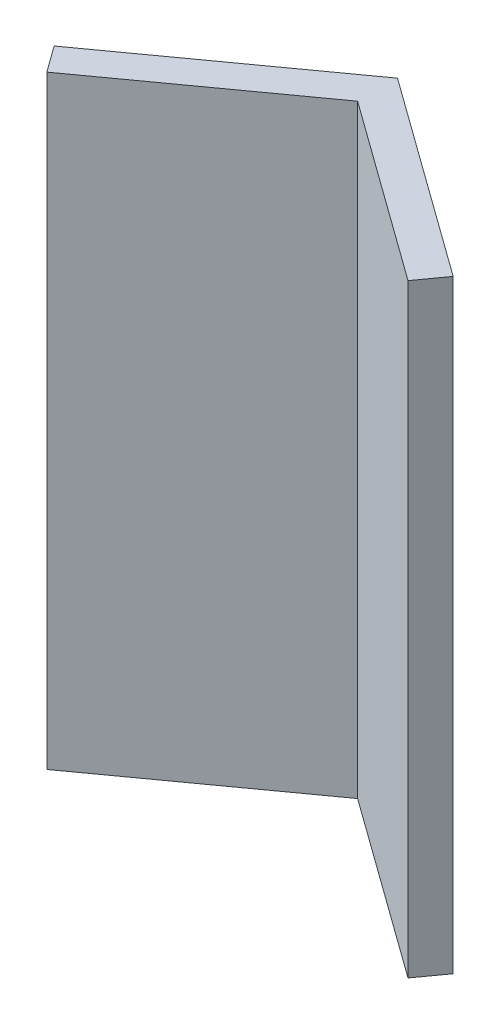
ISO-10303-21;
HEADER;
FILE_DESCRIPTION(('STEP AP214'),'2;1');
FILE_NAME('part.step','',(''),(''),'','','');
FILE_SCHEMA(('AUTOMOTIVE_DESIGN { 1 0 10303 214 1 1 1 1 }'));
ENDSEC;
DATA;
#1=APPLICATION_CONTEXT('core data for automotive mechanical design processes');
#2=APPLICATION_PROTOCOL_DEFINITION('international standard','automotive_design',2000,#1);
#3=PRODUCT_CONTEXT('',#1,'mechanical');
#4=PRODUCT('Part','Part','',(#3));
#5=PRODUCT_RELATED_PRODUCT_CATEGORY('part','',(#4));
#6=PRODUCT_DEFINITION_FORMATION('','',#4);
#7=PRODUCT_DEFINITION_CONTEXT('part definition',#1,'design');
#8=PRODUCT_DEFINITION('design','',#6,#7);
#9=PRODUCT_DEFINITION_SHAPE('','',#8);
#10=(LENGTH_UNIT() NAMED_UNIT(*) SI_UNIT(.MILLI.,.METRE.));
#11=(NAMED_UNIT(*) PLANE_ANGLE_UNIT() SI_UNIT($,.RADIAN.));
#12=(NAMED_UNIT(*) SI_UNIT($,.STERADIAN.) SOLID_ANGLE_UNIT());
#13=UNCERTAINTY_MEASURE_WITH_UNIT(LENGTH_MEASURE(1.E-05),#10,'distance_accuracy_value','');
#14=(GEOMETRIC_REPRESENTATION_CONTEXT(3) GLOBAL_UNCERTAINTY_ASSIGNED_CONTEXT((#13)) GLOBAL_UNIT_ASSIGNED_CONTEXT((#10,
#11,#12)) REPRESENTATION_CONTEXT('',''));
#15=CARTESIAN_POINT('',(0.,0.,0.));
#16=DIRECTION('',(0.,0.,1.));
#17=DIRECTION('',(1.,0.,0.));
#18=AXIS2_PLACEMENT_3D('',#15,#16,#17);
#19=CARTESIAN_POINT('',(33.3006662701754,18.9537375855651,160.949579943678));
#20=DIRECTION('',(0.584774228030169,0.,-0.811196093575234));
#21=DIRECTION('',(-0.811196093575234,0.,-0.584774228030169));
#22=AXIS2_PLACEMENT_3D('',#19,#20,#21);
#23=PLANE('',#22);
#24=DIRECTION('',(0.,1.,0.));
#25=VECTOR('',#24,1.);
#26=CARTESIAN_POINT('',(14.8006662701754,18.9537375855651,147.613318459876));
#27=LINE('',#26,#25);
#28=CARTESIAN_POINT('',(14.8006662701754,18.9537375855651,147.613318459876));
#29=VERTEX_POINT('',#28);
#30=CARTESIAN_POINT('',(14.8006662701754,74.9537375855651,147.613318459876));
#31=VERTEX_POINT('',#30);
#32=EDGE_CURVE('E37',#29,#31,#27,.T.);
#33=ORIENTED_EDGE('',*,*,#32,.T.);
#34=DIRECTION('',(-0.811196093575234,0.,-0.584774228030169));
#35=VECTOR('',#34,1.);
#36=CARTESIAN_POINT('',(33.3006662701754,74.9537375855651,160.949579943678));
#37=LINE('',#36,#35);
#38=CARTESIAN_POINT('',(33.3006662701754,74.9537375855651,160.949579943678));
#39=VERTEX_POINT('',#38);
#40=EDGE_CURVE('E86',#39,#31,#37,.T.);
#41=ORIENTED_EDGE('',*,*,#40,.F.);
#42=DIRECTION('',(0.,1.,0.));
#43=VECTOR('',#42,1.);
#44=CARTESIAN_POINT('',(33.3006662701754,18.9537375855651,160.949579943678));
#45=LINE('',#44,#43);
#46=CARTESIAN_POINT('',(33.3006662701754,18.9537375855651,160.949579943678));
#47=VERTEX_POINT('',#46);
#48=EDGE_CURVE('E11',#47,#39,#45,.T.);
#49=ORIENTED_EDGE('',*,*,#48,.F.);
#50=DIRECTION('',(-0.811196093575234,0.,-0.584774228030169));
#51=VECTOR('',#50,1.);
#52=CARTESIAN_POINT('',(33.3006662701754,18.9537375855651,160.949579943678));
#53=LINE('',#52,#51);
#54=EDGE_CURVE('E87',#47,#29,#53,.T.);
#55=ORIENTED_EDGE('',*,*,#54,.T.);
#56=EDGE_LOOP('',(#33,#41,#49,#55));
#57=FACE_BOUND('',#56,.T.);
#58=ADVANCED_FACE('F34',(#57),#23,.T.);
#59=CARTESIAN_POINT('',(31.5463435860849,18.9537375855651,163.383168224404));
#60=DIRECTION('',(0.811196093575223,0.,0.584774228030184));
#61=DIRECTION('',(0.584774228030184,0.,-0.811196093575223));
#62=AXIS2_PLACEMENT_3D('',#59,#60,#61);
#63=PLANE('',#62);
#64=ORIENTED_EDGE('',*,*,#48,.T.);
#65=DIRECTION('',(0.584774228030184,0.,-0.811196093575223));
#66=VECTOR('',#65,1.);
#67=CARTESIAN_POINT('',(31.5463435860849,74.9537375855651,163.383168224404));
#68=LINE('',#67,#66);
#69=CARTESIAN_POINT('',(31.5463435860849,74.9537375855651,163.383168224404));
#70=VERTEX_POINT('',#69);
#71=EDGE_CURVE('E104',#70,#39,#68,.T.);
#72=ORIENTED_EDGE('',*,*,#71,.F.);
#73=DIRECTION('',(0.,1.,0.));
#74=VECTOR('',#73,1.);
#75=CARTESIAN_POINT('',(31.5463435860849,18.9537375855651,163.383168224404));
#76=LINE('',#75,#74);
#77=CARTESIAN_POINT('',(31.5463435860849,18.9537375855651,163.383168224404));
#78=VERTEX_POINT('',#77);
#79=EDGE_CURVE('E42',#78,#70,#76,.T.);
#80=ORIENTED_EDGE('',*,*,#79,.F.);
#81=DIRECTION('',(0.584774228030184,0.,-0.811196093575223));
#82=VECTOR('',#81,1.);
#83=CARTESIAN_POINT('',(31.5463435860849,18.9537375855651,163.383168224404));
#84=LINE('',#83,#82);
#85=EDGE_CURVE('E92',#78,#47,#84,.T.);
#86=ORIENTED_EDGE('',*,*,#85,.T.);
#87=EDGE_LOOP('',(#64,#72,#80,#86));
#88=FACE_BOUND('',#87,.T.);
#89=ADVANCED_FACE('F144',(#88),#63,.T.);
#90=CARTESIAN_POINT('',(14.8006662701754,18.9537375855651,151.31156112125));
#91=DIRECTION('',(-0.584774228030171,0.,0.811196093575233));
#92=DIRECTION('',(0.811196093575233,0.,0.584774228030171));
#93=AXIS2_PLACEMENT_3D('',#90,#91,#92);
#94=PLANE('',#93);
#95=ORIENTED_EDGE('',*,*,#79,.T.);
#96=DIRECTION('',(0.811196093575233,0.,0.584774228030171));
#97=VECTOR('',#96,1.);
#98=CARTESIAN_POINT('',(14.8006662701754,74.9537375855651,151.31156112125));
#99=LINE('',#98,#97);
#100=CARTESIAN_POINT('',(14.8006662701754,74.9537375855651,151.31156112125));
#101=VERTEX_POINT('',#100);
#102=EDGE_CURVE('E111',#101,#70,#99,.T.);
#103=ORIENTED_EDGE('',*,*,#102,.F.);
#104=DIRECTION('',(0.,1.,0.));
#105=VECTOR('',#104,1.);
#106=CARTESIAN_POINT('',(14.8006662701754,18.9537375855651,151.31156112125));
#107=LINE('',#106,#105);
#108=CARTESIAN_POINT('',(14.8006662701754,18.9537375855651,151.31156112125));
#109=VERTEX_POINT('',#108);
#110=EDGE_CURVE('E127',#109,#101,#107,.T.);
#111=ORIENTED_EDGE('',*,*,#110,.F.);
#112=DIRECTION('',(0.811196093575233,0.,0.584774228030171));
#113=VECTOR('',#112,1.);
#114=CARTESIAN_POINT('',(14.8006662701754,18.9537375855651,151.31156112125));
#115=LINE('',#114,#113);
#116=EDGE_CURVE('E123',#109,#78,#115,.T.);
#117=ORIENTED_EDGE('',*,*,#116,.T.);
#118=EDGE_LOOP('',(#95,#103,#111,#117));
#119=FACE_BOUND('',#118,.T.);
#120=ADVANCED_FACE('F140',(#119),#94,.T.);
#121=CARTESIAN_POINT('',(-1.94501104573404,18.9537375855651,163.383168224404));
#122=DIRECTION('',(0.58477422803017,0.,0.811196093575233));
#123=DIRECTION('',(0.811196093575233,0.,-0.58477422803017));
#124=AXIS2_PLACEMENT_3D('',#121,#122,#123);
#125=PLANE('',#124);
#126=ORIENTED_EDGE('',*,*,#110,.T.);
#127=DIRECTION('',(0.811196093575233,0.,-0.58477422803017));
#128=VECTOR('',#127,1.);
#129=CARTESIAN_POINT('',(-1.94501104573404,74.9537375855651,163.383168224404));
#130=LINE('',#129,#128);
#131=CARTESIAN_POINT('',(-1.94501104573404,74.9537375855651,163.383168224404));
#132=VERTEX_POINT('',#131);
#133=EDGE_CURVE('E108',#132,#101,#130,.T.);
#134=ORIENTED_EDGE('',*,*,#133,.F.);
#135=DIRECTION('',(0.,1.,0.));
#136=VECTOR('',#135,1.);
#137=CARTESIAN_POINT('',(-1.94501104573404,18.9537375855651,163.383168224404));
#138=LINE('',#137,#136);
#139=CARTESIAN_POINT('',(-1.94501104573404,18.9537375855651,163.383168224404));
#140=VERTEX_POINT('',#139);
#141=EDGE_CURVE('E129',#140,#132,#138,.T.);
#142=ORIENTED_EDGE('',*,*,#141,.F.);
#143=DIRECTION('',(0.811196093575233,0.,-0.58477422803017));
#144=VECTOR('',#143,1.);
#145=CARTESIAN_POINT('',(-1.94501104573404,18.9537375855651,163.383168224404));
#146=LINE('',#145,#144);
#147=EDGE_CURVE('E120',#140,#109,#146,.T.);
#148=ORIENTED_EDGE('',*,*,#147,.T.);
#149=EDGE_LOOP('',(#126,#134,#142,#148));
#150=FACE_BOUND('',#149,.T.);
#151=ADVANCED_FACE('F137',(#150),#125,.T.);
#152=CARTESIAN_POINT('',(-3.69933372982456,18.9537375855651,160.949579943678));
#153=DIRECTION('',(-0.811196093575232,0.,0.584774228030172));
#154=DIRECTION('',(0.584774228030172,0.,0.811196093575232));
#155=AXIS2_PLACEMENT_3D('',#152,#153,#154);
#156=PLANE('',#155);
#157=ORIENTED_EDGE('',*,*,#141,.T.);
#158=DIRECTION('',(0.584774228030172,0.,0.811196093575232));
#159=VECTOR('',#158,1.);
#160=CARTESIAN_POINT('',(-3.69933372982456,74.9537375855651,160.949579943678));
#161=LINE('',#160,#159);
#162=CARTESIAN_POINT('',(-3.69933372982456,74.9537375855651,160.949579943678));
#163=VERTEX_POINT('',#162);
#164=EDGE_CURVE('E99',#163,#132,#161,.T.);
#165=ORIENTED_EDGE('',*,*,#164,.F.);
#166=DIRECTION('',(0.,1.,0.));
#167=VECTOR('',#166,1.);
#168=CARTESIAN_POINT('',(-3.69933372982456,18.9537375855651,160.949579943678));
#169=LINE('',#168,#167);
#170=CARTESIAN_POINT('',(-3.69933372982456,18.9537375855651,160.949579943678));
#171=VERTEX_POINT('',#170);
#172=EDGE_CURVE('E91',#171,#163,#169,.T.);
#173=ORIENTED_EDGE('',*,*,#172,.F.);
#174=DIRECTION('',(0.584774228030172,0.,0.811196093575232));
#175=VECTOR('',#174,1.);
#176=CARTESIAN_POINT('',(-3.69933372982456,18.9537375855651,160.949579943678));
#177=LINE('',#176,#175);
#178=EDGE_CURVE('E117',#171,#140,#177,.T.);
#179=ORIENTED_EDGE('',*,*,#178,.T.);
#180=EDGE_LOOP('',(#157,#165,#173,#179));
#181=FACE_BOUND('',#180,.T.);
#182=ADVANCED_FACE('F131',(#181),#156,.T.);
#183=CARTESIAN_POINT('',(14.8006662701754,18.9537375855651,147.613318459876));
#184=DIRECTION('',(-0.58477422803017,0.,-0.811196093575234));
#185=DIRECTION('',(-0.811196093575234,0.,0.58477422803017));
#186=AXIS2_PLACEMENT_3D('',#183,#184,#185);
#187=PLANE('',#186);
#188=ORIENTED_EDGE('',*,*,#172,.T.);
#189=DIRECTION('',(-0.811196093575234,0.,0.58477422803017));
#190=VECTOR('',#189,1.);
#191=CARTESIAN_POINT('',(14.8006662701754,74.9537375855651,147.613318459876));
#192=LINE('',#191,#190);
#193=EDGE_CURVE('E94',#31,#163,#192,.T.);
#194=ORIENTED_EDGE('',*,*,#193,.F.);
#195=ORIENTED_EDGE('',*,*,#32,.F.);
#196=DIRECTION('',(-0.811196093575234,0.,0.58477422803017));
#197=VECTOR('',#196,1.);
#198=CARTESIAN_POINT('',(14.8006662701754,18.9537375855651,147.613318459876));
#199=LINE('',#198,#197);
#200=EDGE_CURVE('E115',#29,#171,#199,.T.);
#201=ORIENTED_EDGE('',*,*,#200,.T.);
#202=EDGE_LOOP('',(#188,#194,#195,#201));
#203=FACE_BOUND('',#202,.T.);
#204=ADVANCED_FACE('F95',(#203),#187,.T.);
#205=CARTESIAN_POINT('',(0.,18.9537375855651,0.));
#206=DIRECTION('',(0.,-1.,0.));
#207=DIRECTION('',(0.,0.,-1.));
#208=AXIS2_PLACEMENT_3D('',#205,#206,#207);
#209=PLANE('',#208);
#210=ORIENTED_EDGE('',*,*,#54,.F.);
#211=ORIENTED_EDGE('',*,*,#85,.F.);
#212=ORIENTED_EDGE('',*,*,#116,.F.);
#213=ORIENTED_EDGE('',*,*,#147,.F.);
#214=ORIENTED_EDGE('',*,*,#178,.F.);
#215=ORIENTED_EDGE('',*,*,#200,.F.);
#216=EDGE_LOOP('',(#210,#211,#212,#213,#214,#215));
#217=FACE_BOUND('',#216,.T.);
#218=ADVANCED_FACE('F143',(#217),#209,.T.);
#219=CARTESIAN_POINT('',(0.,74.9537375855651,0.));
#220=DIRECTION('',(0.,-1.,0.));
#221=DIRECTION('',(0.,0.,-1.));
#222=AXIS2_PLACEMENT_3D('',#219,#220,#221);
#223=PLANE('',#222);
#224=ORIENTED_EDGE('',*,*,#40,.T.);
#225=ORIENTED_EDGE('',*,*,#193,.T.);
#226=ORIENTED_EDGE('',*,*,#164,.T.);
#227=ORIENTED_EDGE('',*,*,#133,.T.);
#228=ORIENTED_EDGE('',*,*,#102,.T.);
#229=ORIENTED_EDGE('',*,*,#71,.T.);
#230=EDGE_LOOP('',(#224,#225,#226,#227,#228,#229));
#231=FACE_BOUND('',#230,.T.);
#232=ADVANCED_FACE('F102',(#231),#223,.F.);
#233=CLOSED_SHELL('',(#58,#89,#120,#151,#182,#204,#218,#232));
#234=MANIFOLD_SOLID_BREP('B2',#233);
#235=ADVANCED_BREP_SHAPE_REPRESENTATION('',(#18,#234),#14);
#236=SHAPE_DEFINITION_REPRESENTATION(#9,#235);
ENDSEC;
END-ISO-10303-21;
